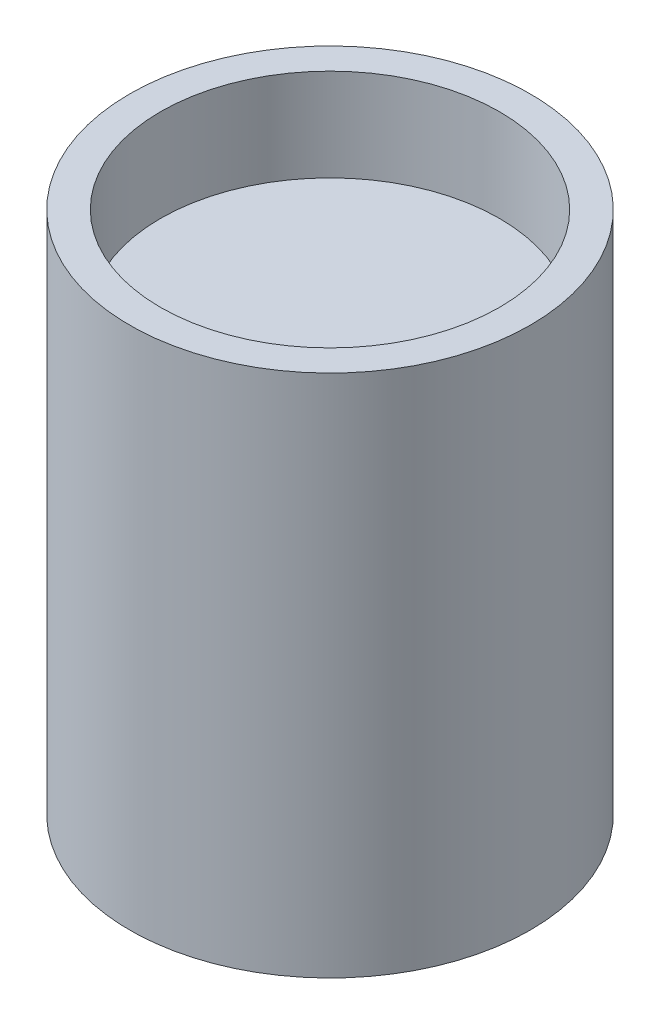
ISO-10303-21;
HEADER;
FILE_DESCRIPTION(('STEP AP214'),'2;1');
FILE_NAME('part.step','',(''),(''),'','','');
FILE_SCHEMA(('AUTOMOTIVE_DESIGN { 1 0 10303 214 1 1 1 1 }'));
ENDSEC;
DATA;
#1=APPLICATION_CONTEXT('core data for automotive mechanical design processes');
#2=APPLICATION_PROTOCOL_DEFINITION('international standard','automotive_design',2000,#1);
#3=PRODUCT_CONTEXT('',#1,'mechanical');
#4=PRODUCT('Part','Part','',(#3));
#5=PRODUCT_RELATED_PRODUCT_CATEGORY('part','',(#4));
#6=PRODUCT_DEFINITION_FORMATION('','',#4);
#7=PRODUCT_DEFINITION_CONTEXT('part definition',#1,'design');
#8=PRODUCT_DEFINITION('design','',#6,#7);
#9=PRODUCT_DEFINITION_SHAPE('','',#8);
#10=(LENGTH_UNIT() NAMED_UNIT(*) SI_UNIT(.MILLI.,.METRE.));
#11=(NAMED_UNIT(*) PLANE_ANGLE_UNIT() SI_UNIT($,.RADIAN.));
#12=(NAMED_UNIT(*) SI_UNIT($,.STERADIAN.) SOLID_ANGLE_UNIT());
#13=UNCERTAINTY_MEASURE_WITH_UNIT(LENGTH_MEASURE(1.E-05),#10,'distance_accuracy_value','');
#14=(GEOMETRIC_REPRESENTATION_CONTEXT(3) GLOBAL_UNCERTAINTY_ASSIGNED_CONTEXT((#13)) GLOBAL_UNIT_ASSIGNED_CONTEXT((#10,
#11,#12)) REPRESENTATION_CONTEXT('',''));
#15=CARTESIAN_POINT('',(0.,0.,0.));
#16=DIRECTION('',(0.,0.,1.));
#17=DIRECTION('',(1.,0.,0.));
#18=AXIS2_PLACEMENT_3D('',#15,#16,#17);
#19=CARTESIAN_POINT('',(-1.27,-1.2,0.));
#20=DIRECTION('',(0.,1.,0.));
#21=DIRECTION('',(1.,0.,0.));
#22=AXIS2_PLACEMENT_3D('',#19,#20,#21);
#23=PLANE('',#22);
#24=DIRECTION('',(0.,0.,-1.));
#25=VECTOR('',#24,1.);
#26=CARTESIAN_POINT('',(-1.57,-1.2,0.3));
#27=LINE('',#26,#25);
#28=CARTESIAN_POINT('',(-1.57,-1.2,0.3));
#29=VERTEX_POINT('',#28);
#30=CARTESIAN_POINT('',(-1.57,-1.2,-0.3));
#31=VERTEX_POINT('',#30);
#32=EDGE_CURVE('E27',#29,#31,#27,.T.);
#33=ORIENTED_EDGE('',*,*,#32,.T.);
#34=DIRECTION('',(1.,0.,0.));
#35=VECTOR('',#34,1.);
#36=CARTESIAN_POINT('',(-1.57,-1.2,-0.3));
#37=LINE('',#36,#35);
#38=CARTESIAN_POINT('',(-0.97,-1.2,-0.3));
#39=VERTEX_POINT('',#38);
#40=EDGE_CURVE('E11',#31,#39,#37,.T.);
#41=ORIENTED_EDGE('',*,*,#40,.T.);
#42=DIRECTION('',(0.,0.,1.));
#43=VECTOR('',#42,1.);
#44=CARTESIAN_POINT('',(-0.97,-1.2,-0.3));
#45=LINE('',#44,#43);
#46=CARTESIAN_POINT('',(-0.97,-1.2,0.3));
#47=VERTEX_POINT('',#46);
#48=EDGE_CURVE('E214',#39,#47,#45,.T.);
#49=ORIENTED_EDGE('',*,*,#48,.T.);
#50=DIRECTION('',(-1.,0.,0.));
#51=VECTOR('',#50,1.);
#52=CARTESIAN_POINT('',(-0.97,-1.2,0.3));
#53=LINE('',#52,#51);
#54=EDGE_CURVE('E210',#47,#29,#53,.T.);
#55=ORIENTED_EDGE('',*,*,#54,.T.);
#56=EDGE_LOOP('',(#33,#41,#49,#55));
#57=FACE_BOUND('',#56,.T.);
#58=ADVANCED_FACE('F18',(#57),#23,.F.);
#59=CARTESIAN_POINT('',(1.27,-1.2,0.));
#60=DIRECTION('',(0.,1.,0.));
#61=DIRECTION('',(1.,0.,0.));
#62=AXIS2_PLACEMENT_3D('',#59,#60,#61);
#63=PLANE('',#62);
#64=DIRECTION('',(1.,0.,0.));
#65=VECTOR('',#64,1.);
#66=CARTESIAN_POINT('',(0.97,-1.2,0.3));
#67=LINE('',#66,#65);
#68=CARTESIAN_POINT('',(0.97,-1.2,0.3));
#69=VERTEX_POINT('',#68);
#70=CARTESIAN_POINT('',(1.57,-1.2,0.3));
#71=VERTEX_POINT('',#70);
#72=EDGE_CURVE('E199',#69,#71,#67,.T.);
#73=ORIENTED_EDGE('',*,*,#72,.F.);
#74=DIRECTION('',(0.,0.,1.));
#75=VECTOR('',#74,1.);
#76=CARTESIAN_POINT('',(0.97,-1.2,-0.3));
#77=LINE('',#76,#75);
#78=CARTESIAN_POINT('',(0.97,-1.2,-0.3));
#79=VERTEX_POINT('',#78);
#80=EDGE_CURVE('E195',#79,#69,#77,.T.);
#81=ORIENTED_EDGE('',*,*,#80,.F.);
#82=DIRECTION('',(-1.,0.,0.));
#83=VECTOR('',#82,1.);
#84=CARTESIAN_POINT('',(1.57,-1.2,-0.3));
#85=LINE('',#84,#83);
#86=CARTESIAN_POINT('',(1.57,-1.2,-0.3));
#87=VERTEX_POINT('',#86);
#88=EDGE_CURVE('E182',#87,#79,#85,.T.);
#89=ORIENTED_EDGE('',*,*,#88,.F.);
#90=DIRECTION('',(0.,0.,-1.));
#91=VECTOR('',#90,1.);
#92=CARTESIAN_POINT('',(1.57,-1.2,0.3));
#93=LINE('',#92,#91);
#94=EDGE_CURVE('E141',#71,#87,#93,.T.);
#95=ORIENTED_EDGE('',*,*,#94,.F.);
#96=EDGE_LOOP('',(#73,#81,#89,#95));
#97=FACE_BOUND('',#96,.T.);
#98=ADVANCED_FACE('F262',(#97),#63,.F.);
#99=CARTESIAN_POINT('',(-1.57,0.,-0.3));
#100=DIRECTION('',(0.,0.,1.));
#101=DIRECTION('',(0.,-1.,0.));
#102=AXIS2_PLACEMENT_3D('',#99,#100,#101);
#103=PLANE('',#102);
#104=DIRECTION('',(1.,0.,0.));
#105=VECTOR('',#104,1.);
#106=CARTESIAN_POINT('',(-1.57,0.,-0.3));
#107=LINE('',#106,#105);
#108=CARTESIAN_POINT('',(-1.57,0.,-0.3));
#109=VERTEX_POINT('',#108);
#110=CARTESIAN_POINT('',(-0.97,0.,-0.3));
#111=VERTEX_POINT('',#110);
#112=EDGE_CURVE('E166',#109,#111,#107,.T.);
#113=ORIENTED_EDGE('',*,*,#112,.T.);
#114=DIRECTION('',(0.,-1.,0.));
#115=VECTOR('',#114,1.);
#116=CARTESIAN_POINT('',(-0.97,0.,-0.3));
#117=LINE('',#116,#115);
#118=EDGE_CURVE('E217',#111,#39,#117,.T.);
#119=ORIENTED_EDGE('',*,*,#118,.T.);
#120=ORIENTED_EDGE('',*,*,#40,.F.);
#121=DIRECTION('',(0.,-1.,0.));
#122=VECTOR('',#121,1.);
#123=CARTESIAN_POINT('',(-1.57,0.,-0.3));
#124=LINE('',#123,#122);
#125=EDGE_CURVE('E222',#109,#31,#124,.T.);
#126=ORIENTED_EDGE('',*,*,#125,.F.);
#127=EDGE_LOOP('',(#113,#119,#120,#126));
#128=FACE_BOUND('',#127,.T.);
#129=ADVANCED_FACE('F235',(#128),#103,.F.);
#130=CARTESIAN_POINT('',(-1.57,0.,0.3));
#131=DIRECTION('',(1.,0.,0.));
#132=DIRECTION('',(0.,1.,0.));
#133=AXIS2_PLACEMENT_3D('',#130,#131,#132);
#134=PLANE('',#133);
#135=DIRECTION('',(0.,0.,-1.));
#136=VECTOR('',#135,1.);
#137=CARTESIAN_POINT('',(-1.57,0.,0.3));
#138=LINE('',#137,#136);
#139=CARTESIAN_POINT('',(-1.57,0.,0.3));
#140=VERTEX_POINT('',#139);
#141=EDGE_CURVE('E174',#140,#109,#138,.T.);
#142=ORIENTED_EDGE('',*,*,#141,.T.);
#143=ORIENTED_EDGE('',*,*,#125,.T.);
#144=ORIENTED_EDGE('',*,*,#32,.F.);
#145=DIRECTION('',(0.,-1.,0.));
#146=VECTOR('',#145,1.);
#147=CARTESIAN_POINT('',(-1.57,0.,0.3));
#148=LINE('',#147,#146);
#149=EDGE_CURVE('E201',#140,#29,#148,.T.);
#150=ORIENTED_EDGE('',*,*,#149,.F.);
#151=EDGE_LOOP('',(#142,#143,#144,#150));
#152=FACE_BOUND('',#151,.T.);
#153=ADVANCED_FACE('F228',(#152),#134,.F.);
#154=CARTESIAN_POINT('',(-0.97,0.,-0.3));
#155=DIRECTION('',(-1.,0.,0.));
#156=DIRECTION('',(0.,0.,1.));
#157=AXIS2_PLACEMENT_3D('',#154,#155,#156);
#158=PLANE('',#157);
#159=DIRECTION('',(0.,0.,1.));
#160=VECTOR('',#159,1.);
#161=CARTESIAN_POINT('',(-0.97,0.,-0.3));
#162=LINE('',#161,#160);
#163=CARTESIAN_POINT('',(-0.97,0.,0.3));
#164=VERTEX_POINT('',#163);
#165=EDGE_CURVE('E153',#111,#164,#162,.T.);
#166=ORIENTED_EDGE('',*,*,#165,.T.);
#167=DIRECTION('',(0.,-1.,0.));
#168=VECTOR('',#167,1.);
#169=CARTESIAN_POINT('',(-0.97,0.,0.3));
#170=LINE('',#169,#168);
#171=EDGE_CURVE('E211',#164,#47,#170,.T.);
#172=ORIENTED_EDGE('',*,*,#171,.T.);
#173=ORIENTED_EDGE('',*,*,#48,.F.);
#174=ORIENTED_EDGE('',*,*,#118,.F.);
#175=EDGE_LOOP('',(#166,#172,#173,#174));
#176=FACE_BOUND('',#175,.T.);
#177=ADVANCED_FACE('F239',(#176),#158,.F.);
#178=CARTESIAN_POINT('',(-0.97,0.,0.3));
#179=DIRECTION('',(0.,0.,-1.));
#180=DIRECTION('',(0.,-1.,0.));
#181=AXIS2_PLACEMENT_3D('',#178,#179,#180);
#182=PLANE('',#181);
#183=DIRECTION('',(-1.,0.,0.));
#184=VECTOR('',#183,1.);
#185=CARTESIAN_POINT('',(-0.97,0.,0.3));
#186=LINE('',#185,#184);
#187=EDGE_CURVE('E173',#164,#140,#186,.T.);
#188=ORIENTED_EDGE('',*,*,#187,.T.);
#189=ORIENTED_EDGE('',*,*,#149,.T.);
#190=ORIENTED_EDGE('',*,*,#54,.F.);
#191=ORIENTED_EDGE('',*,*,#171,.F.);
#192=EDGE_LOOP('',(#188,#189,#190,#191));
#193=FACE_BOUND('',#192,.T.);
#194=ADVANCED_FACE('F245',(#193),#182,.F.);
#195=CARTESIAN_POINT('',(0.97,0.,0.3));
#196=DIRECTION('',(0.,0.,-1.));
#197=DIRECTION('',(0.,-1.,0.));
#198=AXIS2_PLACEMENT_3D('',#195,#196,#197);
#199=PLANE('',#198);
#200=DIRECTION('',(0.,-1.,0.));
#201=VECTOR('',#200,1.);
#202=CARTESIAN_POINT('',(0.97,0.,0.3));
#203=LINE('',#202,#201);
#204=CARTESIAN_POINT('',(0.97,0.,0.3));
#205=VERTEX_POINT('',#204);
#206=EDGE_CURVE('E198',#205,#69,#203,.T.);
#207=ORIENTED_EDGE('',*,*,#206,.T.);
#208=ORIENTED_EDGE('',*,*,#72,.T.);
#209=DIRECTION('',(0.,-1.,0.));
#210=VECTOR('',#209,1.);
#211=CARTESIAN_POINT('',(1.57,0.,0.3));
#212=LINE('',#211,#210);
#213=CARTESIAN_POINT('',(1.57,0.,0.3));
#214=VERTEX_POINT('',#213);
#215=EDGE_CURVE('E146',#214,#71,#212,.T.);
#216=ORIENTED_EDGE('',*,*,#215,.F.);
#217=DIRECTION('',(1.,0.,0.));
#218=VECTOR('',#217,1.);
#219=CARTESIAN_POINT('',(0.97,0.,0.3));
#220=LINE('',#219,#218);
#221=EDGE_CURVE('E132',#205,#214,#220,.T.);
#222=ORIENTED_EDGE('',*,*,#221,.F.);
#223=EDGE_LOOP('',(#207,#208,#216,#222));
#224=FACE_BOUND('',#223,.T.);
#225=ADVANCED_FACE('F254',(#224),#199,.F.);
#226=CARTESIAN_POINT('',(0.97,0.,-0.3));
#227=DIRECTION('',(1.,0.,0.));
#228=DIRECTION('',(0.,1.,0.));
#229=AXIS2_PLACEMENT_3D('',#226,#227,#228);
#230=PLANE('',#229);
#231=DIRECTION('',(0.,-1.,0.));
#232=VECTOR('',#231,1.);
#233=CARTESIAN_POINT('',(0.97,0.,-0.3));
#234=LINE('',#233,#232);
#235=CARTESIAN_POINT('',(0.97,0.,-0.3));
#236=VERTEX_POINT('',#235);
#237=EDGE_CURVE('E187',#236,#79,#234,.T.);
#238=ORIENTED_EDGE('',*,*,#237,.T.);
#239=ORIENTED_EDGE('',*,*,#80,.T.);
#240=ORIENTED_EDGE('',*,*,#206,.F.);
#241=DIRECTION('',(0.,0.,1.));
#242=VECTOR('',#241,1.);
#243=CARTESIAN_POINT('',(0.97,0.,-0.3));
#244=LINE('',#243,#242);
#245=EDGE_CURVE('E140',#236,#205,#244,.T.);
#246=ORIENTED_EDGE('',*,*,#245,.F.);
#247=EDGE_LOOP('',(#238,#239,#240,#246));
#248=FACE_BOUND('',#247,.T.);
#249=ADVANCED_FACE('F265',(#248),#230,.F.);
#250=CARTESIAN_POINT('',(1.57,0.,-0.3));
#251=DIRECTION('',(0.,0.,1.));
#252=DIRECTION('',(0.,-1.,0.));
#253=AXIS2_PLACEMENT_3D('',#250,#251,#252);
#254=PLANE('',#253);
#255=DIRECTION('',(0.,-1.,0.));
#256=VECTOR('',#255,1.);
#257=CARTESIAN_POINT('',(1.57,0.,-0.3));
#258=LINE('',#257,#256);
#259=CARTESIAN_POINT('',(1.57,0.,-0.3));
#260=VERTEX_POINT('',#259);
#261=EDGE_CURVE('E150',#260,#87,#258,.T.);
#262=ORIENTED_EDGE('',*,*,#261,.T.);
#263=ORIENTED_EDGE('',*,*,#88,.T.);
#264=ORIENTED_EDGE('',*,*,#237,.F.);
#265=DIRECTION('',(-1.,0.,0.));
#266=VECTOR('',#265,1.);
#267=CARTESIAN_POINT('',(1.57,0.,-0.3));
#268=LINE('',#267,#266);
#269=EDGE_CURVE('E134',#260,#236,#268,.T.);
#270=ORIENTED_EDGE('',*,*,#269,.F.);
#271=EDGE_LOOP('',(#262,#263,#264,#270));
#272=FACE_BOUND('',#271,.T.);
#273=ADVANCED_FACE('F257',(#272),#254,.F.);
#274=CARTESIAN_POINT('',(1.57,0.,0.3));
#275=DIRECTION('',(-1.,0.,0.));
#276=DIRECTION('',(0.,0.,1.));
#277=AXIS2_PLACEMENT_3D('',#274,#275,#276);
#278=PLANE('',#277);
#279=ORIENTED_EDGE('',*,*,#215,.T.);
#280=ORIENTED_EDGE('',*,*,#94,.T.);
#281=ORIENTED_EDGE('',*,*,#261,.F.);
#282=DIRECTION('',(0.,0.,-1.));
#283=VECTOR('',#282,1.);
#284=CARTESIAN_POINT('',(1.57,0.,0.3));
#285=LINE('',#284,#283);
#286=EDGE_CURVE('E149',#214,#260,#285,.T.);
#287=ORIENTED_EDGE('',*,*,#286,.F.);
#288=EDGE_LOOP('',(#279,#280,#281,#287));
#289=FACE_BOUND('',#288,.T.);
#290=ADVANCED_FACE('F256',(#289),#278,.F.);
#291=CARTESIAN_POINT('',(0.,0.,0.));
#292=DIRECTION('',(0.,1.,0.));
#293=DIRECTION('',(1.,0.,0.));
#294=AXIS2_PLACEMENT_3D('',#291,#292,#293);
#295=PLANE('',#294);
#296=ORIENTED_EDGE('',*,*,#165,.F.);
#297=ORIENTED_EDGE('',*,*,#112,.F.);
#298=ORIENTED_EDGE('',*,*,#141,.F.);
#299=ORIENTED_EDGE('',*,*,#187,.F.);
#300=EDGE_LOOP('',(#296,#297,#298,#299));
#301=FACE_BOUND('',#300,.T.);
#302=ORIENTED_EDGE('',*,*,#269,.T.);
#303=ORIENTED_EDGE('',*,*,#245,.T.);
#304=ORIENTED_EDGE('',*,*,#221,.T.);
#305=ORIENTED_EDGE('',*,*,#286,.T.);
#306=EDGE_LOOP('',(#302,#303,#304,#305));
#307=FACE_BOUND('',#306,.T.);
#308=CARTESIAN_POINT('',(0.,0.,0.));
#309=DIRECTION('',(0.,1.,0.));
#310=DIRECTION('',(-1.,0.,0.));
#311=AXIS2_PLACEMENT_3D('',#308,#309,#310);
#312=CIRCLE('',#311,3.25);
#313=CARTESIAN_POINT('',(-3.25,0.,0.));
#314=VERTEX_POINT('',#313);
#315=EDGE_CURVE('E138',#314,#314,#312,.T.);
#316=ORIENTED_EDGE('',*,*,#315,.F.);
#317=EDGE_LOOP('',(#316));
#318=FACE_BOUND('',#317,.T.);
#319=ADVANCED_FACE('F236',(#301,#307,#318),#295,.F.);
#320=CARTESIAN_POINT('',(0.,8.5,0.));
#321=DIRECTION('',(0.,-1.,0.));
#322=DIRECTION('',(-1.,0.,0.));
#323=AXIS2_PLACEMENT_3D('',#320,#321,#322);
#324=CYLINDRICAL_SURFACE('',#323,3.25);
#325=DIRECTION('',(0.,-1.,0.));
#326=VECTOR('',#325,1.);
#327=CARTESIAN_POINT('',(-3.25,8.5,0.));
#328=LINE('',#327,#326);
#329=CARTESIAN_POINT('',(-3.25,8.5,0.));
#330=VERTEX_POINT('',#329);
#331=EDGE_CURVE('E160',#330,#314,#328,.T.);
#332=ORIENTED_EDGE('',*,*,#331,.T.);
#333=ORIENTED_EDGE('',*,*,#315,.T.);
#334=ORIENTED_EDGE('',*,*,#331,.F.);
#335=CARTESIAN_POINT('',(0.,8.5,0.));
#336=DIRECTION('',(0.,1.,0.));
#337=DIRECTION('',(-1.,0.,0.));
#338=AXIS2_PLACEMENT_3D('',#335,#336,#337);
#339=CIRCLE('',#338,3.25);
#340=EDGE_CURVE('E142',#330,#330,#339,.T.);
#341=ORIENTED_EDGE('',*,*,#340,.F.);
#342=EDGE_LOOP('',(#332,#333,#334,#341));
#343=FACE_BOUND('',#342,.T.);
#344=ADVANCED_FACE('F284',(#343),#324,.T.);
#345=CARTESIAN_POINT('',(0.,8.5,0.));
#346=DIRECTION('',(0.,1.,0.));
#347=DIRECTION('',(1.,0.,0.));
#348=AXIS2_PLACEMENT_3D('',#345,#346,#347);
#349=PLANE('',#348);
#350=ORIENTED_EDGE('',*,*,#340,.T.);
#351=EDGE_LOOP('',(#350));
#352=FACE_BOUND('',#351,.T.);
#353=CARTESIAN_POINT('',(0.,8.5,0.));
#354=DIRECTION('',(0.,1.,0.));
#355=DIRECTION('',(-1.,0.,0.));
#356=AXIS2_PLACEMENT_3D('',#353,#354,#355);
#357=CIRCLE('',#356,2.75);
#358=CARTESIAN_POINT('',(-2.75,8.5,0.));
#359=VERTEX_POINT('',#358);
#360=EDGE_CURVE('E121',#359,#359,#357,.T.);
#361=ORIENTED_EDGE('',*,*,#360,.F.);
#362=EDGE_LOOP('',(#361));
#363=FACE_BOUND('',#362,.T.);
#364=ADVANCED_FACE('F286',(#352,#363),#349,.T.);
#365=CARTESIAN_POINT('',(0.,7.,0.));
#366=DIRECTION('',(0.,1.,0.));
#367=DIRECTION('',(-1.,0.,0.));
#368=AXIS2_PLACEMENT_3D('',#365,#366,#367);
#369=CYLINDRICAL_SURFACE('',#368,2.75);
#370=DIRECTION('',(0.,1.,0.));
#371=VECTOR('',#370,1.);
#372=CARTESIAN_POINT('',(-2.75,7.,0.));
#373=LINE('',#372,#371);
#374=CARTESIAN_POINT('',(-2.75,7.,0.));
#375=VERTEX_POINT('',#374);
#376=EDGE_CURVE('E116',#375,#359,#373,.T.);
#377=ORIENTED_EDGE('',*,*,#376,.T.);
#378=ORIENTED_EDGE('',*,*,#360,.T.);
#379=ORIENTED_EDGE('',*,*,#376,.F.);
#380=CARTESIAN_POINT('',(0.,7.,0.));
#381=DIRECTION('',(0.,1.,0.));
#382=DIRECTION('',(-1.,0.,0.));
#383=AXIS2_PLACEMENT_3D('',#380,#381,#382);
#384=CIRCLE('',#383,2.75);
#385=EDGE_CURVE('E118',#375,#375,#384,.T.);
#386=ORIENTED_EDGE('',*,*,#385,.F.);
#387=EDGE_LOOP('',(#377,#378,#379,#386));
#388=FACE_BOUND('',#387,.T.);
#389=ADVANCED_FACE('F119',(#388),#369,.F.);
#390=CARTESIAN_POINT('',(0.,7.,0.));
#391=DIRECTION('',(0.,1.,0.));
#392=DIRECTION('',(1.,0.,0.));
#393=AXIS2_PLACEMENT_3D('',#390,#391,#392);
#394=PLANE('',#393);
#395=ORIENTED_EDGE('',*,*,#385,.T.);
#396=EDGE_LOOP('',(#395));
#397=FACE_BOUND('',#396,.T.);
#398=ADVANCED_FACE('F124',(#397),#394,.T.);
#399=CLOSED_SHELL('',(#58,#98,#129,#153,#177,#194,#225,#249,#273,#290,#319,#344,#364,#389,#398));
#400=MANIFOLD_SOLID_BREP('B1',#399);
#401=ADVANCED_BREP_SHAPE_REPRESENTATION('',(#18,#400),#14);
#402=SHAPE_DEFINITION_REPRESENTATION(#9,#401);
ENDSEC;
END-ISO-10303-21;
